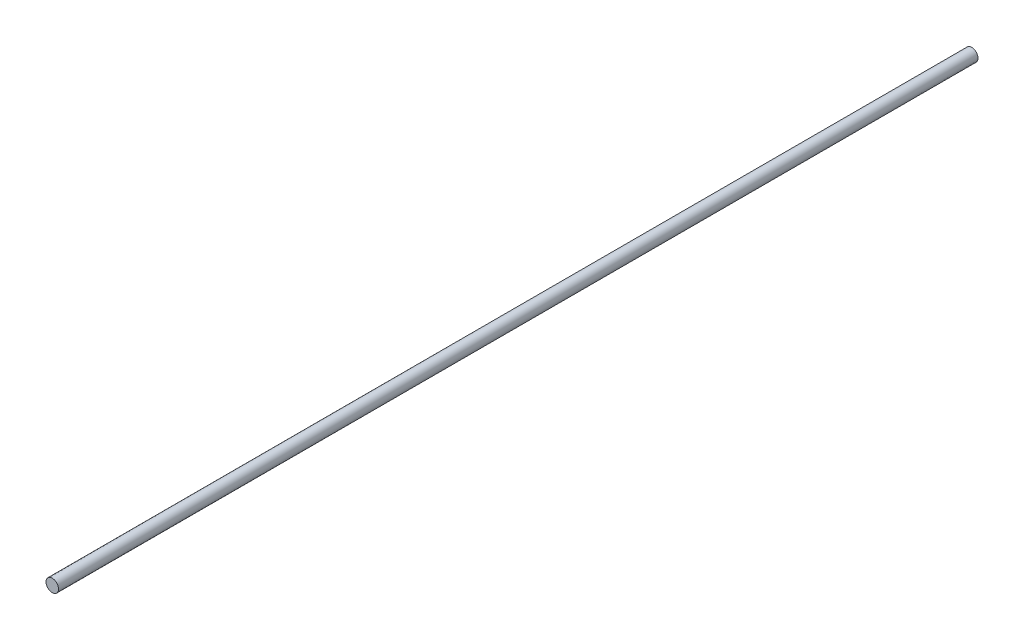
ISO-10303-21;
HEADER;
FILE_DESCRIPTION(('STEP AP214'),'2;1');
FILE_NAME('part.step','',(''),(''),'','','');
FILE_SCHEMA(('AUTOMOTIVE_DESIGN { 1 0 10303 214 1 1 1 1 }'));
ENDSEC;
DATA;
#1=APPLICATION_CONTEXT('core data for automotive mechanical design processes');
#2=APPLICATION_PROTOCOL_DEFINITION('international standard','automotive_design',2000,#1);
#3=PRODUCT_CONTEXT('',#1,'mechanical');
#4=PRODUCT('Part','Part','',(#3));
#5=PRODUCT_RELATED_PRODUCT_CATEGORY('part','',(#4));
#6=PRODUCT_DEFINITION_FORMATION('','',#4);
#7=PRODUCT_DEFINITION_CONTEXT('part definition',#1,'design');
#8=PRODUCT_DEFINITION('design','',#6,#7);
#9=PRODUCT_DEFINITION_SHAPE('','',#8);
#10=(LENGTH_UNIT() NAMED_UNIT(*) SI_UNIT(.MILLI.,.METRE.));
#11=(NAMED_UNIT(*) PLANE_ANGLE_UNIT() SI_UNIT($,.RADIAN.));
#12=(NAMED_UNIT(*) SI_UNIT($,.STERADIAN.) SOLID_ANGLE_UNIT());
#13=UNCERTAINTY_MEASURE_WITH_UNIT(LENGTH_MEASURE(1.E-05),#10,'distance_accuracy_value','');
#14=(GEOMETRIC_REPRESENTATION_CONTEXT(3) GLOBAL_UNCERTAINTY_ASSIGNED_CONTEXT((#13)) GLOBAL_UNIT_ASSIGNED_CONTEXT((#10,
#11,#12)) REPRESENTATION_CONTEXT('',''));
#15=CARTESIAN_POINT('',(0.,0.,0.));
#16=DIRECTION('',(0.,0.,1.));
#17=DIRECTION('',(1.,0.,0.));
#18=AXIS2_PLACEMENT_3D('',#15,#16,#17);
#19=CARTESIAN_POINT('',(0.,0.,440.));
#20=DIRECTION('',(0.,0.,-1.));
#21=DIRECTION('',(-1.,0.,0.));
#22=AXIS2_PLACEMENT_3D('',#19,#20,#21);
#23=CYLINDRICAL_SURFACE('',#22,6.);
#24=CARTESIAN_POINT('',(0.,0.,440.));
#25=DIRECTION('',(0.,0.,1.));
#26=DIRECTION('',(1.,0.,0.));
#27=AXIS2_PLACEMENT_3D('',#24,#25,#26);
#28=CIRCLE('',#27,6.);
#29=CARTESIAN_POINT('',(6.,0.,440.));
#30=VERTEX_POINT('',#29);
#31=EDGE_CURVE('E10',#30,#30,#28,.T.);
#32=ORIENTED_EDGE('',*,*,#31,.F.);
#33=EDGE_LOOP('',(#32));
#34=FACE_BOUND('',#33,.T.);
#35=CARTESIAN_POINT('',(0.,0.,-440.));
#36=DIRECTION('',(0.,0.,1.));
#37=DIRECTION('',(1.,0.,0.));
#38=AXIS2_PLACEMENT_3D('',#35,#36,#37);
#39=CIRCLE('',#38,6.);
#40=CARTESIAN_POINT('',(6.,0.,-440.));
#41=VERTEX_POINT('',#40);
#42=EDGE_CURVE('E37',#41,#41,#39,.T.);
#43=ORIENTED_EDGE('',*,*,#42,.T.);
#44=EDGE_LOOP('',(#43));
#45=FACE_BOUND('',#44,.T.);
#46=ADVANCED_FACE('F34',(#34,#45),#23,.T.);
#47=CARTESIAN_POINT('',(0.,0.,440.));
#48=DIRECTION('',(0.,0.,1.));
#49=DIRECTION('',(1.,0.,0.));
#50=AXIS2_PLACEMENT_3D('',#47,#48,#49);
#51=PLANE('',#50);
#52=ORIENTED_EDGE('',*,*,#31,.T.);
#53=EDGE_LOOP('',(#52));
#54=FACE_BOUND('',#53,.T.);
#55=ADVANCED_FACE('F49',(#54),#51,.T.);
#56=CARTESIAN_POINT('',(0.,0.,-440.));
#57=DIRECTION('',(0.,0.,1.));
#58=DIRECTION('',(1.,0.,0.));
#59=AXIS2_PLACEMENT_3D('',#56,#57,#58);
#60=PLANE('',#59);
#61=ORIENTED_EDGE('',*,*,#42,.F.);
#62=EDGE_LOOP('',(#61));
#63=FACE_BOUND('',#62,.T.);
#64=ADVANCED_FACE('F47',(#63),#60,.F.);
#65=CLOSED_SHELL('',(#46,#55,#64));
#66=MANIFOLD_SOLID_BREP('B2',#65);
#67=ADVANCED_BREP_SHAPE_REPRESENTATION('',(#18,#66),#14);
#68=SHAPE_DEFINITION_REPRESENTATION(#9,#67);
ENDSEC;
END-ISO-10303-21;
